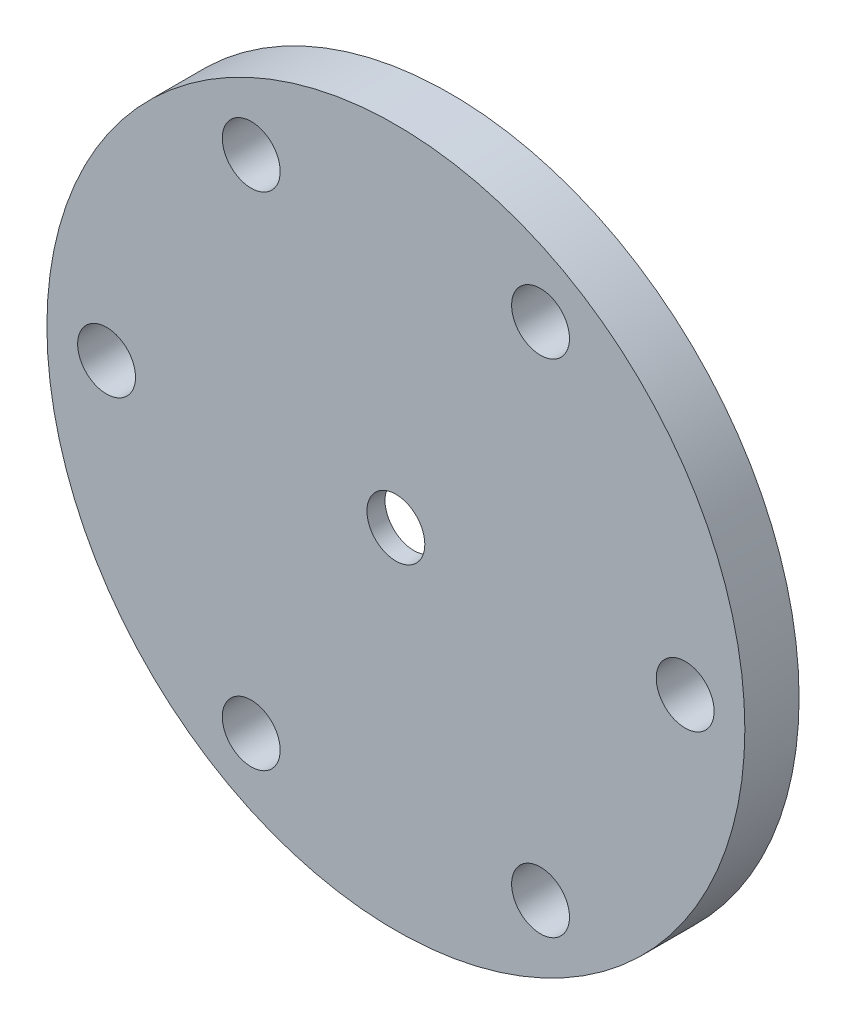
ISO-10303-21;
HEADER;
FILE_DESCRIPTION(('STEP AP214'),'2;1');
FILE_NAME('part.step','',(''),(''),'','','');
FILE_SCHEMA(('AUTOMOTIVE_DESIGN { 1 0 10303 214 1 1 1 1 }'));
ENDSEC;
DATA;
#1=APPLICATION_CONTEXT('core data for automotive mechanical design processes');
#2=APPLICATION_PROTOCOL_DEFINITION('international standard','automotive_design',2000,#1);
#3=PRODUCT_CONTEXT('',#1,'mechanical');
#4=PRODUCT('Part','Part','',(#3));
#5=PRODUCT_RELATED_PRODUCT_CATEGORY('part','',(#4));
#6=PRODUCT_DEFINITION_FORMATION('','',#4);
#7=PRODUCT_DEFINITION_CONTEXT('part definition',#1,'design');
#8=PRODUCT_DEFINITION('design','',#6,#7);
#9=PRODUCT_DEFINITION_SHAPE('','',#8);
#10=(LENGTH_UNIT() NAMED_UNIT(*) SI_UNIT(.MILLI.,.METRE.));
#11=(NAMED_UNIT(*) PLANE_ANGLE_UNIT() SI_UNIT($,.RADIAN.));
#12=(NAMED_UNIT(*) SI_UNIT($,.STERADIAN.) SOLID_ANGLE_UNIT());
#13=UNCERTAINTY_MEASURE_WITH_UNIT(LENGTH_MEASURE(1.E-05),#10,'distance_accuracy_value','');
#14=(GEOMETRIC_REPRESENTATION_CONTEXT(3) GLOBAL_UNCERTAINTY_ASSIGNED_CONTEXT((#13)) GLOBAL_UNIT_ASSIGNED_CONTEXT((#10,
#11,#12)) REPRESENTATION_CONTEXT('',''));
#15=CARTESIAN_POINT('',(0.,0.,0.));
#16=DIRECTION('',(0.,0.,1.));
#17=DIRECTION('',(1.,0.,0.));
#18=AXIS2_PLACEMENT_3D('',#15,#16,#17);
#19=CARTESIAN_POINT('',(0.,0.,1.5));
#20=DIRECTION('',(0.,0.,-1.));
#21=DIRECTION('',(-1.,0.,0.));
#22=AXIS2_PLACEMENT_3D('',#19,#20,#21);
#23=CYLINDRICAL_SURFACE('',#22,1.6);
#24=CARTESIAN_POINT('',(0.,0.,1.5));
#25=DIRECTION('',(0.,0.,1.));
#26=DIRECTION('',(1.,0.,0.));
#27=AXIS2_PLACEMENT_3D('',#24,#25,#26);
#28=CIRCLE('',#27,1.6);
#29=CARTESIAN_POINT('',(1.6,0.,1.5));
#30=VERTEX_POINT('',#29);
#31=EDGE_CURVE('E46',#30,#30,#28,.T.);
#32=ORIENTED_EDGE('',*,*,#31,.T.);
#33=EDGE_LOOP('',(#32));
#34=FACE_BOUND('',#33,.T.);
#35=CARTESIAN_POINT('',(0.,0.,0.5));
#36=DIRECTION('',(0.,0.,-1.));
#37=DIRECTION('',(-1.,0.,0.));
#38=AXIS2_PLACEMENT_3D('',#35,#36,#37);
#39=CIRCLE('',#38,1.6);
#40=CARTESIAN_POINT('',(-1.6,0.,0.5));
#41=VERTEX_POINT('',#40);
#42=EDGE_CURVE('E85',#41,#41,#39,.T.);
#43=ORIENTED_EDGE('',*,*,#42,.T.);
#44=EDGE_LOOP('',(#43));
#45=FACE_BOUND('',#44,.T.);
#46=ADVANCED_FACE('F30',(#34,#45),#23,.F.);
#47=CARTESIAN_POINT('',(0.,0.,1.5));
#48=DIRECTION('',(0.,0.,1.));
#49=DIRECTION('',(1.,0.,0.));
#50=AXIS2_PLACEMENT_3D('',#47,#48,#49);
#51=PLANE('',#50);
#52=CARTESIAN_POINT('',(-8.00000000000007,-13.856406460551,1.5));
#53=DIRECTION('',(0.,0.,1.));
#54=DIRECTION('',(1.,0.,0.));
#55=AXIS2_PLACEMENT_3D('',#52,#53,#54);
#56=CIRCLE('',#55,1.6);
#57=CARTESIAN_POINT('',(-6.40000000000007,-13.856406460551,1.5));
#58=VERTEX_POINT('',#57);
#59=EDGE_CURVE('E67',#58,#58,#56,.T.);
#60=ORIENTED_EDGE('',*,*,#59,.F.);
#61=EDGE_LOOP('',(#60));
#62=FACE_BOUND('',#61,.T.);
#63=CARTESIAN_POINT('',(16.,0.,1.5));
#64=DIRECTION('',(0.,0.,1.));
#65=DIRECTION('',(1.,0.,0.));
#66=AXIS2_PLACEMENT_3D('',#63,#64,#65);
#67=CIRCLE('',#66,1.60000000000001);
#68=CARTESIAN_POINT('',(17.6,0.,1.5));
#69=VERTEX_POINT('',#68);
#70=EDGE_CURVE('E55',#69,#69,#67,.T.);
#71=ORIENTED_EDGE('',*,*,#70,.F.);
#72=EDGE_LOOP('',(#71));
#73=FACE_BOUND('',#72,.T.);
#74=ORIENTED_EDGE('',*,*,#31,.F.);
#75=EDGE_LOOP('',(#74));
#76=FACE_BOUND('',#75,.T.);
#77=CARTESIAN_POINT('',(0.,0.,1.5));
#78=DIRECTION('',(0.,0.,1.));
#79=DIRECTION('',(1.,0.,0.));
#80=AXIS2_PLACEMENT_3D('',#77,#78,#79);
#81=CIRCLE('',#80,19.3);
#82=CARTESIAN_POINT('',(19.3,0.,1.5));
#83=VERTEX_POINT('',#82);
#84=EDGE_CURVE('E10',#83,#83,#81,.T.);
#85=ORIENTED_EDGE('',*,*,#84,.T.);
#86=EDGE_LOOP('',(#85));
#87=FACE_BOUND('',#86,.T.);
#88=CARTESIAN_POINT('',(-7.99999999999992,13.8564064605511,1.5));
#89=DIRECTION('',(0.,0.,1.));
#90=DIRECTION('',(1.,0.,0.));
#91=AXIS2_PLACEMENT_3D('',#88,#89,#90);
#92=CIRCLE('',#91,1.6);
#93=CARTESIAN_POINT('',(-6.39999999999992,13.8564064605511,1.5));
#94=VERTEX_POINT('',#93);
#95=EDGE_CURVE('E41',#94,#94,#92,.T.);
#96=ORIENTED_EDGE('',*,*,#95,.F.);
#97=EDGE_LOOP('',(#96));
#98=FACE_BOUND('',#97,.T.);
#99=CARTESIAN_POINT('',(8.00000000000007,13.856406460551,1.5));
#100=DIRECTION('',(0.,0.,1.));
#101=DIRECTION('',(1.,0.,0.));
#102=AXIS2_PLACEMENT_3D('',#99,#100,#101);
#103=CIRCLE('',#102,1.6);
#104=CARTESIAN_POINT('',(9.60000000000008,13.856406460551,1.5));
#105=VERTEX_POINT('',#104);
#106=EDGE_CURVE('E51',#105,#105,#103,.T.);
#107=ORIENTED_EDGE('',*,*,#106,.F.);
#108=EDGE_LOOP('',(#107));
#109=FACE_BOUND('',#108,.T.);
#110=CARTESIAN_POINT('',(7.99999999999992,-13.8564064605511,1.5));
#111=DIRECTION('',(0.,0.,1.));
#112=DIRECTION('',(1.,0.,0.));
#113=AXIS2_PLACEMENT_3D('',#110,#111,#112);
#114=CIRCLE('',#113,1.6);
#115=CARTESIAN_POINT('',(9.59999999999992,-13.8564064605511,1.5));
#116=VERTEX_POINT('',#115);
#117=EDGE_CURVE('E61',#116,#116,#114,.T.);
#118=ORIENTED_EDGE('',*,*,#117,.F.);
#119=EDGE_LOOP('',(#118));
#120=FACE_BOUND('',#119,.T.);
#121=CARTESIAN_POINT('',(-16.,0.,1.5));
#122=DIRECTION('',(0.,0.,1.));
#123=DIRECTION('',(1.,0.,0.));
#124=AXIS2_PLACEMENT_3D('',#121,#122,#123);
#125=CIRCLE('',#124,1.6);
#126=CARTESIAN_POINT('',(-14.4,0.,1.5));
#127=VERTEX_POINT('',#126);
#128=EDGE_CURVE('E73',#127,#127,#125,.T.);
#129=ORIENTED_EDGE('',*,*,#128,.F.);
#130=EDGE_LOOP('',(#129));
#131=FACE_BOUND('',#130,.T.);
#132=ADVANCED_FACE('F108',(#62,#73,#76,#87,#98,#109,#120,#131),#51,.T.);
#133=CARTESIAN_POINT('',(0.,0.,-1.5));
#134=DIRECTION('',(0.,0.,1.));
#135=DIRECTION('',(1.,0.,0.));
#136=AXIS2_PLACEMENT_3D('',#133,#134,#135);
#137=PLANE('',#136);
#138=CARTESIAN_POINT('',(0.,0.,-1.5));
#139=DIRECTION('',(0.,0.,-1.));
#140=DIRECTION('',(-1.,0.,0.));
#141=AXIS2_PLACEMENT_3D('',#138,#139,#140);
#142=CIRCLE('',#141,12.);
#143=CARTESIAN_POINT('',(-12.,0.,-1.5));
#144=VERTEX_POINT('',#143);
#145=EDGE_CURVE('E82',#144,#144,#142,.T.);
#146=ORIENTED_EDGE('',*,*,#145,.F.);
#147=EDGE_LOOP('',(#146));
#148=FACE_BOUND('',#147,.T.);
#149=CARTESIAN_POINT('',(0.,0.,-1.5));
#150=DIRECTION('',(0.,0.,1.));
#151=DIRECTION('',(1.,0.,0.));
#152=AXIS2_PLACEMENT_3D('',#149,#150,#151);
#153=CIRCLE('',#152,19.3);
#154=CARTESIAN_POINT('',(19.3,0.,-1.5));
#155=VERTEX_POINT('',#154);
#156=EDGE_CURVE('E34',#155,#155,#153,.T.);
#157=ORIENTED_EDGE('',*,*,#156,.F.);
#158=EDGE_LOOP('',(#157));
#159=FACE_BOUND('',#158,.T.);
#160=CARTESIAN_POINT('',(-7.99999999999992,13.8564064605511,-1.5));
#161=DIRECTION('',(0.,0.,1.));
#162=DIRECTION('',(1.,0.,0.));
#163=AXIS2_PLACEMENT_3D('',#160,#161,#162);
#164=CIRCLE('',#163,1.6);
#165=CARTESIAN_POINT('',(-6.39999999999992,13.8564064605511,-1.5));
#166=VERTEX_POINT('',#165);
#167=EDGE_CURVE('E43',#166,#166,#164,.T.);
#168=ORIENTED_EDGE('',*,*,#167,.T.);
#169=EDGE_LOOP('',(#168));
#170=FACE_BOUND('',#169,.T.);
#171=CARTESIAN_POINT('',(8.00000000000007,13.856406460551,-1.5));
#172=DIRECTION('',(0.,0.,1.));
#173=DIRECTION('',(1.,0.,0.));
#174=AXIS2_PLACEMENT_3D('',#171,#172,#173);
#175=CIRCLE('',#174,1.6);
#176=CARTESIAN_POINT('',(9.60000000000008,13.856406460551,-1.5));
#177=VERTEX_POINT('',#176);
#178=EDGE_CURVE('E52',#177,#177,#175,.T.);
#179=ORIENTED_EDGE('',*,*,#178,.T.);
#180=EDGE_LOOP('',(#179));
#181=FACE_BOUND('',#180,.T.);
#182=CARTESIAN_POINT('',(16.,0.,-1.5));
#183=DIRECTION('',(0.,0.,1.));
#184=DIRECTION('',(1.,0.,0.));
#185=AXIS2_PLACEMENT_3D('',#182,#183,#184);
#186=CIRCLE('',#185,1.60000000000001);
#187=CARTESIAN_POINT('',(17.6,0.,-1.5));
#188=VERTEX_POINT('',#187);
#189=EDGE_CURVE('E58',#188,#188,#186,.T.);
#190=ORIENTED_EDGE('',*,*,#189,.T.);
#191=EDGE_LOOP('',(#190));
#192=FACE_BOUND('',#191,.T.);
#193=CARTESIAN_POINT('',(7.99999999999992,-13.8564064605511,-1.5));
#194=DIRECTION('',(0.,0.,1.));
#195=DIRECTION('',(1.,0.,0.));
#196=AXIS2_PLACEMENT_3D('',#193,#194,#195);
#197=CIRCLE('',#196,1.6);
#198=CARTESIAN_POINT('',(9.59999999999992,-13.8564064605511,-1.5));
#199=VERTEX_POINT('',#198);
#200=EDGE_CURVE('E64',#199,#199,#197,.T.);
#201=ORIENTED_EDGE('',*,*,#200,.T.);
#202=EDGE_LOOP('',(#201));
#203=FACE_BOUND('',#202,.T.);
#204=CARTESIAN_POINT('',(-8.00000000000007,-13.856406460551,-1.5));
#205=DIRECTION('',(0.,0.,1.));
#206=DIRECTION('',(1.,0.,0.));
#207=AXIS2_PLACEMENT_3D('',#204,#205,#206);
#208=CIRCLE('',#207,1.6);
#209=CARTESIAN_POINT('',(-6.40000000000007,-13.856406460551,-1.5));
#210=VERTEX_POINT('',#209);
#211=EDGE_CURVE('E70',#210,#210,#208,.T.);
#212=ORIENTED_EDGE('',*,*,#211,.T.);
#213=EDGE_LOOP('',(#212));
#214=FACE_BOUND('',#213,.T.);
#215=CARTESIAN_POINT('',(-16.,0.,-1.5));
#216=DIRECTION('',(0.,0.,1.));
#217=DIRECTION('',(1.,0.,0.));
#218=AXIS2_PLACEMENT_3D('',#215,#216,#217);
#219=CIRCLE('',#218,1.6);
#220=CARTESIAN_POINT('',(-14.4,0.,-1.5));
#221=VERTEX_POINT('',#220);
#222=EDGE_CURVE('E76',#221,#221,#219,.T.);
#223=ORIENTED_EDGE('',*,*,#222,.T.);
#224=EDGE_LOOP('',(#223));
#225=FACE_BOUND('',#224,.T.);
#226=ADVANCED_FACE('F105',(#148,#159,#170,#181,#192,#203,#214,#225),#137,.F.);
#227=CARTESIAN_POINT('',(0.,0.,1.5));
#228=DIRECTION('',(0.,0.,-1.));
#229=DIRECTION('',(-1.,0.,0.));
#230=AXIS2_PLACEMENT_3D('',#227,#228,#229);
#231=CYLINDRICAL_SURFACE('',#230,19.3);
#232=ORIENTED_EDGE('',*,*,#84,.F.);
#233=EDGE_LOOP('',(#232));
#234=FACE_BOUND('',#233,.T.);
#235=ORIENTED_EDGE('',*,*,#156,.T.);
#236=EDGE_LOOP('',(#235));
#237=FACE_BOUND('',#236,.T.);
#238=ADVANCED_FACE('F32',(#234,#237),#231,.T.);
#239=CARTESIAN_POINT('',(-7.99999999999992,13.8564064605511,1.5));
#240=DIRECTION('',(0.,0.,-1.));
#241=DIRECTION('',(-1.,0.,0.));
#242=AXIS2_PLACEMENT_3D('',#239,#240,#241);
#243=CYLINDRICAL_SURFACE('',#242,1.6);
#244=ORIENTED_EDGE('',*,*,#95,.T.);
#245=EDGE_LOOP('',(#244));
#246=FACE_BOUND('',#245,.T.);
#247=ORIENTED_EDGE('',*,*,#167,.F.);
#248=EDGE_LOOP('',(#247));
#249=FACE_BOUND('',#248,.T.);
#250=ADVANCED_FACE('F145',(#246,#249),#243,.F.);
#251=CARTESIAN_POINT('',(8.00000000000007,13.856406460551,1.5));
#252=DIRECTION('',(0.,0.,-1.));
#253=DIRECTION('',(-1.,0.,0.));
#254=AXIS2_PLACEMENT_3D('',#251,#252,#253);
#255=CYLINDRICAL_SURFACE('',#254,1.6);
#256=ORIENTED_EDGE('',*,*,#106,.T.);
#257=EDGE_LOOP('',(#256));
#258=FACE_BOUND('',#257,.T.);
#259=ORIENTED_EDGE('',*,*,#178,.F.);
#260=EDGE_LOOP('',(#259));
#261=FACE_BOUND('',#260,.T.);
#262=ADVANCED_FACE('F143',(#258,#261),#255,.F.);
#263=CARTESIAN_POINT('',(16.,0.,1.5));
#264=DIRECTION('',(0.,0.,-1.));
#265=DIRECTION('',(-1.,0.,0.));
#266=AXIS2_PLACEMENT_3D('',#263,#264,#265);
#267=CYLINDRICAL_SURFACE('',#266,1.60000000000001);
#268=ORIENTED_EDGE('',*,*,#70,.T.);
#269=EDGE_LOOP('',(#268));
#270=FACE_BOUND('',#269,.T.);
#271=ORIENTED_EDGE('',*,*,#189,.F.);
#272=EDGE_LOOP('',(#271));
#273=FACE_BOUND('',#272,.T.);
#274=ADVANCED_FACE('F152',(#270,#273),#267,.F.);
#275=CARTESIAN_POINT('',(7.99999999999992,-13.8564064605511,1.5));
#276=DIRECTION('',(0.,0.,-1.));
#277=DIRECTION('',(-1.,0.,0.));
#278=AXIS2_PLACEMENT_3D('',#275,#276,#277);
#279=CYLINDRICAL_SURFACE('',#278,1.6);
#280=ORIENTED_EDGE('',*,*,#117,.T.);
#281=EDGE_LOOP('',(#280));
#282=FACE_BOUND('',#281,.T.);
#283=ORIENTED_EDGE('',*,*,#200,.F.);
#284=EDGE_LOOP('',(#283));
#285=FACE_BOUND('',#284,.T.);
#286=ADVANCED_FACE('F130',(#282,#285),#279,.F.);
#287=CARTESIAN_POINT('',(-8.00000000000007,-13.856406460551,1.5));
#288=DIRECTION('',(0.,0.,-1.));
#289=DIRECTION('',(-1.,0.,0.));
#290=AXIS2_PLACEMENT_3D('',#287,#288,#289);
#291=CYLINDRICAL_SURFACE('',#290,1.6);
#292=ORIENTED_EDGE('',*,*,#59,.T.);
#293=EDGE_LOOP('',(#292));
#294=FACE_BOUND('',#293,.T.);
#295=ORIENTED_EDGE('',*,*,#211,.F.);
#296=EDGE_LOOP('',(#295));
#297=FACE_BOUND('',#296,.T.);
#298=ADVANCED_FACE('F124',(#294,#297),#291,.F.);
#299=CARTESIAN_POINT('',(-16.,0.,1.5));
#300=DIRECTION('',(0.,0.,-1.));
#301=DIRECTION('',(-1.,0.,0.));
#302=AXIS2_PLACEMENT_3D('',#299,#300,#301);
#303=CYLINDRICAL_SURFACE('',#302,1.6);
#304=ORIENTED_EDGE('',*,*,#128,.T.);
#305=EDGE_LOOP('',(#304));
#306=FACE_BOUND('',#305,.T.);
#307=ORIENTED_EDGE('',*,*,#222,.F.);
#308=EDGE_LOOP('',(#307));
#309=FACE_BOUND('',#308,.T.);
#310=ADVANCED_FACE('F101',(#306,#309),#303,.F.);
#311=CARTESIAN_POINT('',(0.,0.,0.5));
#312=DIRECTION('',(0.,0.,-1.));
#313=DIRECTION('',(-1.,0.,0.));
#314=AXIS2_PLACEMENT_3D('',#311,#312,#313);
#315=CYLINDRICAL_SURFACE('',#314,12.);
#316=CARTESIAN_POINT('',(0.,0.,0.5));
#317=DIRECTION('',(0.,0.,-1.));
#318=DIRECTION('',(-1.,0.,0.));
#319=AXIS2_PLACEMENT_3D('',#316,#317,#318);
#320=CIRCLE('',#319,12.);
#321=CARTESIAN_POINT('',(-12.,0.,0.5));
#322=VERTEX_POINT('',#321);
#323=EDGE_CURVE('E79',#322,#322,#320,.T.);
#324=ORIENTED_EDGE('',*,*,#323,.F.);
#325=EDGE_LOOP('',(#324));
#326=FACE_BOUND('',#325,.T.);
#327=ORIENTED_EDGE('',*,*,#145,.T.);
#328=EDGE_LOOP('',(#327));
#329=FACE_BOUND('',#328,.T.);
#330=ADVANCED_FACE('F95',(#326,#329),#315,.F.);
#331=CARTESIAN_POINT('',(0.,0.,0.5));
#332=DIRECTION('',(0.,0.,-1.));
#333=DIRECTION('',(-1.,0.,0.));
#334=AXIS2_PLACEMENT_3D('',#331,#332,#333);
#335=PLANE('',#334);
#336=ORIENTED_EDGE('',*,*,#42,.F.);
#337=EDGE_LOOP('',(#336));
#338=FACE_BOUND('',#337,.T.);
#339=ORIENTED_EDGE('',*,*,#323,.T.);
#340=EDGE_LOOP('',(#339));
#341=FACE_BOUND('',#340,.T.);
#342=ADVANCED_FACE('F92',(#338,#341),#335,.T.);
#343=CLOSED_SHELL('',(#46,#132,#226,#238,#250,#262,#274,#286,#298,#310,#330,#342));
#344=MANIFOLD_SOLID_BREP('B2',#343);
#345=ADVANCED_BREP_SHAPE_REPRESENTATION('',(#18,#344),#14);
#346=SHAPE_DEFINITION_REPRESENTATION(#9,#345);
ENDSEC;
END-ISO-10303-21;
